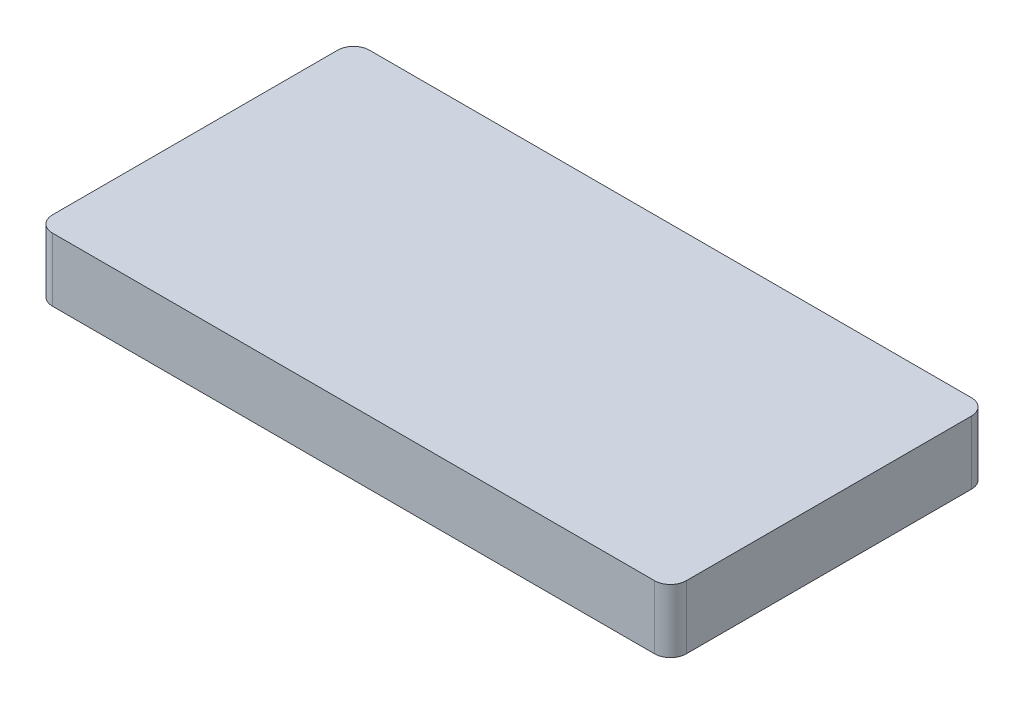
ISO-10303-21;
HEADER;
FILE_DESCRIPTION(('STEP AP214'),'2;1');
FILE_NAME('part.step','',(''),(''),'','','');
FILE_SCHEMA(('AUTOMOTIVE_DESIGN { 1 0 10303 214 1 1 1 1 }'));
ENDSEC;
DATA;
#1=APPLICATION_CONTEXT('core data for automotive mechanical design processes');
#2=APPLICATION_PROTOCOL_DEFINITION('international standard','automotive_design',2000,#1);
#3=PRODUCT_CONTEXT('',#1,'mechanical');
#4=PRODUCT('Part','Part','',(#3));
#5=PRODUCT_RELATED_PRODUCT_CATEGORY('part','',(#4));
#6=PRODUCT_DEFINITION_FORMATION('','',#4);
#7=PRODUCT_DEFINITION_CONTEXT('part definition',#1,'design');
#8=PRODUCT_DEFINITION('design','',#6,#7);
#9=PRODUCT_DEFINITION_SHAPE('','',#8);
#10=(LENGTH_UNIT() NAMED_UNIT(*) SI_UNIT(.MILLI.,.METRE.));
#11=(NAMED_UNIT(*) PLANE_ANGLE_UNIT() SI_UNIT($,.RADIAN.));
#12=(NAMED_UNIT(*) SI_UNIT($,.STERADIAN.) SOLID_ANGLE_UNIT());
#13=UNCERTAINTY_MEASURE_WITH_UNIT(LENGTH_MEASURE(1.E-05),#10,'distance_accuracy_value','');
#14=(GEOMETRIC_REPRESENTATION_CONTEXT(3) GLOBAL_UNCERTAINTY_ASSIGNED_CONTEXT((#13)) GLOBAL_UNIT_ASSIGNED_CONTEXT((#10,
#11,#12)) REPRESENTATION_CONTEXT('',''));
#15=CARTESIAN_POINT('',(0.,0.,0.));
#16=DIRECTION('',(0.,0.,1.));
#17=DIRECTION('',(1.,0.,0.));
#18=AXIS2_PLACEMENT_3D('',#15,#16,#17);
#19=CARTESIAN_POINT('',(0.,2.54,-12.7));
#20=DIRECTION('',(1.,0.,0.));
#21=DIRECTION('',(0.,0.,-1.));
#22=AXIS2_PLACEMENT_3D('',#19,#20,#21);
#23=PLANE('',#22);
#24=DIRECTION('',(0.,0.,1.));
#25=VECTOR('',#24,1.);
#26=CARTESIAN_POINT('',(0.,2.54,-12.7));
#27=LINE('',#26,#25);
#28=CARTESIAN_POINT('',(0.,2.54,-12.065));
#29=VERTEX_POINT('',#28);
#30=CARTESIAN_POINT('',(0.,2.54,-0.635));
#31=VERTEX_POINT('',#30);
#32=EDGE_CURVE('E161',#29,#31,#27,.T.);
#33=ORIENTED_EDGE('',*,*,#32,.F.);
#34=DIRECTION('',(0.,-1.,0.));
#35=VECTOR('',#34,1.);
#36=CARTESIAN_POINT('',(0.,2.54,-12.065));
#37=LINE('',#36,#35);
#38=CARTESIAN_POINT('',(0.,0.,-12.065));
#39=VERTEX_POINT('',#38);
#40=EDGE_CURVE('E186',#29,#39,#37,.T.);
#41=ORIENTED_EDGE('',*,*,#40,.T.);
#42=DIRECTION('',(0.,0.,1.));
#43=VECTOR('',#42,1.);
#44=CARTESIAN_POINT('',(0.,0.,-12.7));
#45=LINE('',#44,#43);
#46=CARTESIAN_POINT('',(0.,0.,-0.635));
#47=VERTEX_POINT('',#46);
#48=EDGE_CURVE('E174',#39,#47,#45,.T.);
#49=ORIENTED_EDGE('',*,*,#48,.T.);
#50=DIRECTION('',(0.,-1.,0.));
#51=VECTOR('',#50,1.);
#52=CARTESIAN_POINT('',(0.,2.54,-0.635));
#53=LINE('',#52,#51);
#54=EDGE_CURVE('E173',#47,#31,#53,.F.);
#55=ORIENTED_EDGE('',*,*,#54,.T.);
#56=EDGE_LOOP('',(#33,#41,#49,#55));
#57=FACE_BOUND('',#56,.T.);
#58=ADVANCED_FACE('F32',(#57),#23,.F.);
#59=CARTESIAN_POINT('',(0.,2.54,0.));
#60=DIRECTION('',(0.,0.,-1.));
#61=DIRECTION('',(-1.,0.,0.));
#62=AXIS2_PLACEMENT_3D('',#59,#60,#61);
#63=PLANE('',#62);
#64=DIRECTION('',(1.,0.,0.));
#65=VECTOR('',#64,1.);
#66=CARTESIAN_POINT('',(0.,0.,0.));
#67=LINE('',#66,#65);
#68=CARTESIAN_POINT('',(0.635,0.,0.));
#69=VERTEX_POINT('',#68);
#70=CARTESIAN_POINT('',(24.765,0.,0.));
#71=VERTEX_POINT('',#70);
#72=EDGE_CURVE('E177',#69,#71,#67,.T.);
#73=ORIENTED_EDGE('',*,*,#72,.T.);
#74=DIRECTION('',(0.,-1.,0.));
#75=VECTOR('',#74,1.);
#76=CARTESIAN_POINT('',(24.765,2.54,0.));
#77=LINE('',#76,#75);
#78=CARTESIAN_POINT('',(24.765,2.54,0.));
#79=VERTEX_POINT('',#78);
#80=EDGE_CURVE('E40',#71,#79,#77,.F.);
#81=ORIENTED_EDGE('',*,*,#80,.T.);
#82=DIRECTION('',(1.,0.,0.));
#83=VECTOR('',#82,1.);
#84=CARTESIAN_POINT('',(0.,2.54,0.));
#85=LINE('',#84,#83);
#86=CARTESIAN_POINT('',(0.635,2.54,0.));
#87=VERTEX_POINT('',#86);
#88=EDGE_CURVE('E164',#87,#79,#85,.T.);
#89=ORIENTED_EDGE('',*,*,#88,.F.);
#90=DIRECTION('',(0.,-1.,0.));
#91=VECTOR('',#90,1.);
#92=CARTESIAN_POINT('',(0.635,2.54,0.));
#93=LINE('',#92,#91);
#94=EDGE_CURVE('E214',#87,#69,#93,.T.);
#95=ORIENTED_EDGE('',*,*,#94,.T.);
#96=EDGE_LOOP('',(#73,#81,#89,#95));
#97=FACE_BOUND('',#96,.T.);
#98=ADVANCED_FACE('F219',(#97),#63,.F.);
#99=CARTESIAN_POINT('',(25.4,2.54,0.));
#100=DIRECTION('',(-1.,0.,0.));
#101=DIRECTION('',(0.,0.,1.));
#102=AXIS2_PLACEMENT_3D('',#99,#100,#101);
#103=PLANE('',#102);
#104=DIRECTION('',(0.,0.,-1.));
#105=VECTOR('',#104,1.);
#106=CARTESIAN_POINT('',(25.4,0.,0.));
#107=LINE('',#106,#105);
#108=CARTESIAN_POINT('',(25.4,0.,-0.635000000000001));
#109=VERTEX_POINT('',#108);
#110=CARTESIAN_POINT('',(25.4,0.,-12.065));
#111=VERTEX_POINT('',#110);
#112=EDGE_CURVE('E181',#109,#111,#107,.T.);
#113=ORIENTED_EDGE('',*,*,#112,.T.);
#114=DIRECTION('',(0.,-1.,0.));
#115=VECTOR('',#114,1.);
#116=CARTESIAN_POINT('',(25.4,2.54,-12.065));
#117=LINE('',#116,#115);
#118=CARTESIAN_POINT('',(25.4,2.54,-12.065));
#119=VERTEX_POINT('',#118);
#120=EDGE_CURVE('E55',#111,#119,#117,.F.);
#121=ORIENTED_EDGE('',*,*,#120,.T.);
#122=DIRECTION('',(0.,0.,-1.));
#123=VECTOR('',#122,1.);
#124=CARTESIAN_POINT('',(25.4,2.54,0.));
#125=LINE('',#124,#123);
#126=CARTESIAN_POINT('',(25.4,2.54,-0.635000000000001));
#127=VERTEX_POINT('',#126);
#128=EDGE_CURVE('E168',#127,#119,#125,.T.);
#129=ORIENTED_EDGE('',*,*,#128,.F.);
#130=DIRECTION('',(0.,-1.,0.));
#131=VECTOR('',#130,1.);
#132=CARTESIAN_POINT('',(25.4,2.54,-0.635000000000001));
#133=LINE('',#132,#131);
#134=EDGE_CURVE('E210',#127,#109,#133,.T.);
#135=ORIENTED_EDGE('',*,*,#134,.T.);
#136=EDGE_LOOP('',(#113,#121,#129,#135));
#137=FACE_BOUND('',#136,.T.);
#138=ADVANCED_FACE('F230',(#137),#103,.F.);
#139=CARTESIAN_POINT('',(25.4,2.54,-12.7));
#140=DIRECTION('',(0.,0.,1.));
#141=DIRECTION('',(1.,0.,0.));
#142=AXIS2_PLACEMENT_3D('',#139,#140,#141);
#143=PLANE('',#142);
#144=DIRECTION('',(-1.,0.,0.));
#145=VECTOR('',#144,1.);
#146=CARTESIAN_POINT('',(25.4,0.,-12.7));
#147=LINE('',#146,#145);
#148=CARTESIAN_POINT('',(24.765,0.,-12.7));
#149=VERTEX_POINT('',#148);
#150=CARTESIAN_POINT('',(0.634999999999997,0.,-12.7));
#151=VERTEX_POINT('',#150);
#152=EDGE_CURVE('E165',#149,#151,#147,.T.);
#153=ORIENTED_EDGE('',*,*,#152,.T.);
#154=DIRECTION('',(0.,-1.,0.));
#155=VECTOR('',#154,1.);
#156=CARTESIAN_POINT('',(0.634999999999997,2.54,-12.7));
#157=LINE('',#156,#155);
#158=CARTESIAN_POINT('',(0.634999999999997,2.54,-12.7));
#159=VERTEX_POINT('',#158);
#160=EDGE_CURVE('E200',#151,#159,#157,.F.);
#161=ORIENTED_EDGE('',*,*,#160,.T.);
#162=DIRECTION('',(-1.,0.,0.));
#163=VECTOR('',#162,1.);
#164=CARTESIAN_POINT('',(25.4,2.54,-12.7));
#165=LINE('',#164,#163);
#166=CARTESIAN_POINT('',(24.765,2.54,-12.7));
#167=VERTEX_POINT('',#166);
#168=EDGE_CURVE('E170',#167,#159,#165,.T.);
#169=ORIENTED_EDGE('',*,*,#168,.F.);
#170=DIRECTION('',(0.,-1.,0.));
#171=VECTOR('',#170,1.);
#172=CARTESIAN_POINT('',(24.765,2.54,-12.7));
#173=LINE('',#172,#171);
#174=EDGE_CURVE('E197',#167,#149,#173,.T.);
#175=ORIENTED_EDGE('',*,*,#174,.T.);
#176=EDGE_LOOP('',(#153,#161,#169,#175));
#177=FACE_BOUND('',#176,.T.);
#178=ADVANCED_FACE('F241',(#177),#143,.F.);
#179=CARTESIAN_POINT('',(0.,2.54,0.));
#180=DIRECTION('',(0.,1.,0.));
#181=DIRECTION('',(0.,0.,1.));
#182=AXIS2_PLACEMENT_3D('',#179,#180,#181);
#183=PLANE('',#182);
#184=ORIENTED_EDGE('',*,*,#168,.T.);
#185=CARTESIAN_POINT('',(0.634999999999995,2.54,-12.065));
#186=DIRECTION('',(0.,1.,0.));
#187=DIRECTION('',(0.,0.,1.));
#188=AXIS2_PLACEMENT_3D('',#185,#186,#187);
#189=CIRCLE('',#188,0.635);
#190=EDGE_CURVE('E208',#159,#29,#189,.T.);
#191=ORIENTED_EDGE('',*,*,#190,.T.);
#192=ORIENTED_EDGE('',*,*,#32,.T.);
#193=CARTESIAN_POINT('',(0.635,2.54,-0.635));
#194=DIRECTION('',(0.,1.,0.));
#195=DIRECTION('',(0.,0.,1.));
#196=AXIS2_PLACEMENT_3D('',#193,#194,#195);
#197=CIRCLE('',#196,0.635);
#198=EDGE_CURVE('E202',#31,#87,#197,.T.);
#199=ORIENTED_EDGE('',*,*,#198,.T.);
#200=ORIENTED_EDGE('',*,*,#88,.T.);
#201=CARTESIAN_POINT('',(24.765,2.54,-0.635));
#202=DIRECTION('',(0.,1.,0.));
#203=DIRECTION('',(0.,0.,1.));
#204=AXIS2_PLACEMENT_3D('',#201,#202,#203);
#205=CIRCLE('',#204,0.635);
#206=EDGE_CURVE('E204',#79,#127,#205,.T.);
#207=ORIENTED_EDGE('',*,*,#206,.T.);
#208=ORIENTED_EDGE('',*,*,#128,.T.);
#209=CARTESIAN_POINT('',(24.765,2.54,-12.065));
#210=DIRECTION('',(0.,1.,0.));
#211=DIRECTION('',(0.,0.,1.));
#212=AXIS2_PLACEMENT_3D('',#209,#210,#211);
#213=CIRCLE('',#212,0.635);
#214=EDGE_CURVE('E206',#119,#167,#213,.T.);
#215=ORIENTED_EDGE('',*,*,#214,.T.);
#216=EDGE_LOOP('',(#184,#191,#192,#199,#200,#207,#208,#215));
#217=FACE_BOUND('',#216,.T.);
#218=ADVANCED_FACE('F225',(#217),#183,.T.);
#219=CARTESIAN_POINT('',(0.,0.,0.));
#220=DIRECTION('',(0.,1.,0.));
#221=DIRECTION('',(0.,0.,1.));
#222=AXIS2_PLACEMENT_3D('',#219,#220,#221);
#223=PLANE('',#222);
#224=DIRECTION('',(-1.,0.,0.));
#225=VECTOR('',#224,1.);
#226=CARTESIAN_POINT('',(25.4,0.,-12.065));
#227=LINE('',#226,#225);
#228=CARTESIAN_POINT('',(24.765,0.,-12.065));
#229=VERTEX_POINT('',#228);
#230=CARTESIAN_POINT('',(0.634999999999995,0.,-12.065));
#231=VERTEX_POINT('',#230);
#232=EDGE_CURVE('E133',#229,#231,#227,.T.);
#233=ORIENTED_EDGE('',*,*,#232,.T.);
#234=DIRECTION('',(0.,0.,1.));
#235=VECTOR('',#234,1.);
#236=CARTESIAN_POINT('',(0.634999999999995,0.,-12.7));
#237=LINE('',#236,#235);
#238=CARTESIAN_POINT('',(0.635,0.,-0.635));
#239=VERTEX_POINT('',#238);
#240=EDGE_CURVE('E139',#231,#239,#237,.T.);
#241=ORIENTED_EDGE('',*,*,#240,.T.);
#242=DIRECTION('',(1.,0.,0.));
#243=VECTOR('',#242,1.);
#244=CARTESIAN_POINT('',(0.,0.,-0.635));
#245=LINE('',#244,#243);
#246=CARTESIAN_POINT('',(24.765,0.,-0.635));
#247=VERTEX_POINT('',#246);
#248=EDGE_CURVE('E155',#239,#247,#245,.T.);
#249=ORIENTED_EDGE('',*,*,#248,.T.);
#250=DIRECTION('',(0.,0.,-1.));
#251=VECTOR('',#250,1.);
#252=CARTESIAN_POINT('',(24.765,0.,0.));
#253=LINE('',#252,#251);
#254=EDGE_CURVE('E47',#247,#229,#253,.T.);
#255=ORIENTED_EDGE('',*,*,#254,.T.);
#256=EDGE_LOOP('',(#233,#241,#249,#255));
#257=FACE_BOUND('',#256,.T.);
#258=ORIENTED_EDGE('',*,*,#48,.F.);
#259=CARTESIAN_POINT('',(0.634999999999995,0.,-12.065));
#260=DIRECTION('',(0.,1.,0.));
#261=DIRECTION('',(0.,0.,1.));
#262=AXIS2_PLACEMENT_3D('',#259,#260,#261);
#263=CIRCLE('',#262,0.635);
#264=EDGE_CURVE('E195',#39,#151,#263,.F.);
#265=ORIENTED_EDGE('',*,*,#264,.T.);
#266=ORIENTED_EDGE('',*,*,#152,.F.);
#267=CARTESIAN_POINT('',(24.765,0.,-12.065));
#268=DIRECTION('',(0.,1.,0.));
#269=DIRECTION('',(0.,0.,1.));
#270=AXIS2_PLACEMENT_3D('',#267,#268,#269);
#271=CIRCLE('',#270,0.635);
#272=EDGE_CURVE('E193',#149,#111,#271,.F.);
#273=ORIENTED_EDGE('',*,*,#272,.T.);
#274=ORIENTED_EDGE('',*,*,#112,.F.);
#275=CARTESIAN_POINT('',(24.765,0.,-0.635));
#276=DIRECTION('',(0.,1.,0.));
#277=DIRECTION('',(0.,0.,1.));
#278=AXIS2_PLACEMENT_3D('',#275,#276,#277);
#279=CIRCLE('',#278,0.635);
#280=EDGE_CURVE('E191',#109,#71,#279,.F.);
#281=ORIENTED_EDGE('',*,*,#280,.T.);
#282=ORIENTED_EDGE('',*,*,#72,.F.);
#283=CARTESIAN_POINT('',(0.635,0.,-0.635));
#284=DIRECTION('',(0.,1.,0.));
#285=DIRECTION('',(0.,0.,1.));
#286=AXIS2_PLACEMENT_3D('',#283,#284,#285);
#287=CIRCLE('',#286,0.635);
#288=EDGE_CURVE('E189',#69,#47,#287,.F.);
#289=ORIENTED_EDGE('',*,*,#288,.T.);
#290=EDGE_LOOP('',(#258,#265,#266,#273,#274,#281,#282,#289));
#291=FACE_BOUND('',#290,.T.);
#292=ADVANCED_FACE('F233',(#257,#291),#223,.F.);
#293=CARTESIAN_POINT('',(0.634999999999995,2.54,-12.065));
#294=DIRECTION('',(0.,-1.,0.));
#295=DIRECTION('',(0.,0.,-1.));
#296=AXIS2_PLACEMENT_3D('',#293,#294,#295);
#297=CYLINDRICAL_SURFACE('',#296,0.635);
#298=ORIENTED_EDGE('',*,*,#190,.F.);
#299=ORIENTED_EDGE('',*,*,#160,.F.);
#300=ORIENTED_EDGE('',*,*,#264,.F.);
#301=ORIENTED_EDGE('',*,*,#40,.F.);
#302=EDGE_LOOP('',(#298,#299,#300,#301));
#303=FACE_BOUND('',#302,.T.);
#304=ADVANCED_FACE('F247',(#303),#297,.T.);
#305=CARTESIAN_POINT('',(24.765,2.54,-12.065));
#306=DIRECTION('',(0.,-1.,0.));
#307=DIRECTION('',(0.,0.,-1.));
#308=AXIS2_PLACEMENT_3D('',#305,#306,#307);
#309=CYLINDRICAL_SURFACE('',#308,0.635);
#310=ORIENTED_EDGE('',*,*,#214,.F.);
#311=ORIENTED_EDGE('',*,*,#120,.F.);
#312=ORIENTED_EDGE('',*,*,#272,.F.);
#313=ORIENTED_EDGE('',*,*,#174,.F.);
#314=EDGE_LOOP('',(#310,#311,#312,#313));
#315=FACE_BOUND('',#314,.T.);
#316=ADVANCED_FACE('F238',(#315),#309,.T.);
#317=CARTESIAN_POINT('',(24.765,2.54,-0.635));
#318=DIRECTION('',(0.,-1.,0.));
#319=DIRECTION('',(0.,0.,-1.));
#320=AXIS2_PLACEMENT_3D('',#317,#318,#319);
#321=CYLINDRICAL_SURFACE('',#320,0.635);
#322=ORIENTED_EDGE('',*,*,#206,.F.);
#323=ORIENTED_EDGE('',*,*,#80,.F.);
#324=ORIENTED_EDGE('',*,*,#280,.F.);
#325=ORIENTED_EDGE('',*,*,#134,.F.);
#326=EDGE_LOOP('',(#322,#323,#324,#325));
#327=FACE_BOUND('',#326,.T.);
#328=ADVANCED_FACE('F228',(#327),#321,.T.);
#329=CARTESIAN_POINT('',(0.635,2.54,-0.635));
#330=DIRECTION('',(0.,-1.,0.));
#331=DIRECTION('',(0.,0.,-1.));
#332=AXIS2_PLACEMENT_3D('',#329,#330,#331);
#333=CYLINDRICAL_SURFACE('',#332,0.635);
#334=ORIENTED_EDGE('',*,*,#198,.F.);
#335=ORIENTED_EDGE('',*,*,#54,.F.);
#336=ORIENTED_EDGE('',*,*,#288,.F.);
#337=ORIENTED_EDGE('',*,*,#94,.F.);
#338=EDGE_LOOP('',(#334,#335,#336,#337));
#339=FACE_BOUND('',#338,.T.);
#340=ADVANCED_FACE('F34',(#339),#333,.T.);
#341=CARTESIAN_POINT('',(0.634999999999995,2.54,-12.7));
#342=DIRECTION('',(1.,0.,0.));
#343=DIRECTION('',(0.,0.,-1.));
#344=AXIS2_PLACEMENT_3D('',#341,#342,#343);
#345=PLANE('',#344);
#346=DIRECTION('',(0.,0.,1.));
#347=VECTOR('',#346,1.);
#348=CARTESIAN_POINT('',(0.634999999999995,1.905,-12.7));
#349=LINE('',#348,#347);
#350=CARTESIAN_POINT('',(0.634999999999995,1.905,-12.065));
#351=VERTEX_POINT('',#350);
#352=CARTESIAN_POINT('',(0.635,1.905,-0.635));
#353=VERTEX_POINT('',#352);
#354=EDGE_CURVE('E123',#351,#353,#349,.T.);
#355=ORIENTED_EDGE('',*,*,#354,.T.);
#356=DIRECTION('',(0.,1.,0.));
#357=VECTOR('',#356,1.);
#358=CARTESIAN_POINT('',(0.635,2.54,-0.635));
#359=LINE('',#358,#357);
#360=EDGE_CURVE('E144',#239,#353,#359,.T.);
#361=ORIENTED_EDGE('',*,*,#360,.F.);
#362=ORIENTED_EDGE('',*,*,#240,.F.);
#363=DIRECTION('',(0.,1.,0.));
#364=VECTOR('',#363,1.);
#365=CARTESIAN_POINT('',(0.634999999999993,2.54,-12.065));
#366=LINE('',#365,#364);
#367=EDGE_CURVE('E136',#231,#351,#366,.T.);
#368=ORIENTED_EDGE('',*,*,#367,.T.);
#369=EDGE_LOOP('',(#355,#361,#362,#368));
#370=FACE_BOUND('',#369,.T.);
#371=ADVANCED_FACE('F137',(#370),#345,.T.);
#372=CARTESIAN_POINT('',(0.,2.54,-0.635));
#373=DIRECTION('',(0.,0.,-1.));
#374=DIRECTION('',(-1.,0.,0.));
#375=AXIS2_PLACEMENT_3D('',#372,#373,#374);
#376=PLANE('',#375);
#377=ORIENTED_EDGE('',*,*,#248,.F.);
#378=ORIENTED_EDGE('',*,*,#360,.T.);
#379=DIRECTION('',(1.,0.,0.));
#380=VECTOR('',#379,1.);
#381=CARTESIAN_POINT('',(0.,1.905,-0.635));
#382=LINE('',#381,#380);
#383=CARTESIAN_POINT('',(24.765,1.905,-0.635));
#384=VERTEX_POINT('',#383);
#385=EDGE_CURVE('E130',#353,#384,#382,.T.);
#386=ORIENTED_EDGE('',*,*,#385,.T.);
#387=DIRECTION('',(0.,1.,0.));
#388=VECTOR('',#387,1.);
#389=CARTESIAN_POINT('',(24.765,2.54,-0.635));
#390=LINE('',#389,#388);
#391=EDGE_CURVE('E178',#247,#384,#390,.T.);
#392=ORIENTED_EDGE('',*,*,#391,.F.);
#393=EDGE_LOOP('',(#377,#378,#386,#392));
#394=FACE_BOUND('',#393,.T.);
#395=ADVANCED_FACE('F256',(#394),#376,.T.);
#396=CARTESIAN_POINT('',(24.765,2.54,0.));
#397=DIRECTION('',(-1.,0.,0.));
#398=DIRECTION('',(0.,0.,1.));
#399=AXIS2_PLACEMENT_3D('',#396,#397,#398);
#400=PLANE('',#399);
#401=ORIENTED_EDGE('',*,*,#254,.F.);
#402=ORIENTED_EDGE('',*,*,#391,.T.);
#403=DIRECTION('',(0.,0.,-1.));
#404=VECTOR('',#403,1.);
#405=CARTESIAN_POINT('',(24.765,1.905,0.));
#406=LINE('',#405,#404);
#407=CARTESIAN_POINT('',(24.765,1.905,-12.065));
#408=VERTEX_POINT('',#407);
#409=EDGE_CURVE('E148',#384,#408,#406,.T.);
#410=ORIENTED_EDGE('',*,*,#409,.T.);
#411=DIRECTION('',(0.,1.,0.));
#412=VECTOR('',#411,1.);
#413=CARTESIAN_POINT('',(24.765,2.54,-12.065));
#414=LINE('',#413,#412);
#415=EDGE_CURVE('E143',#229,#408,#414,.T.);
#416=ORIENTED_EDGE('',*,*,#415,.F.);
#417=EDGE_LOOP('',(#401,#402,#410,#416));
#418=FACE_BOUND('',#417,.T.);
#419=ADVANCED_FACE('F308',(#418),#400,.T.);
#420=CARTESIAN_POINT('',(25.4,2.54,-12.065));
#421=DIRECTION('',(0.,0.,1.));
#422=DIRECTION('',(1.,0.,0.));
#423=AXIS2_PLACEMENT_3D('',#420,#421,#422);
#424=PLANE('',#423);
#425=ORIENTED_EDGE('',*,*,#232,.F.);
#426=ORIENTED_EDGE('',*,*,#415,.T.);
#427=DIRECTION('',(-1.,0.,0.));
#428=VECTOR('',#427,1.);
#429=CARTESIAN_POINT('',(25.4,1.905,-12.065));
#430=LINE('',#429,#428);
#431=EDGE_CURVE('E127',#408,#351,#430,.T.);
#432=ORIENTED_EDGE('',*,*,#431,.T.);
#433=ORIENTED_EDGE('',*,*,#367,.F.);
#434=EDGE_LOOP('',(#425,#426,#432,#433));
#435=FACE_BOUND('',#434,.T.);
#436=ADVANCED_FACE('F146',(#435),#424,.T.);
#437=CARTESIAN_POINT('',(0.,1.905,0.));
#438=DIRECTION('',(0.,1.,0.));
#439=DIRECTION('',(0.,0.,1.));
#440=AXIS2_PLACEMENT_3D('',#437,#438,#439);
#441=PLANE('',#440);
#442=CARTESIAN_POINT('',(12.7,1.905,-6.35));
#443=DIRECTION('',(0.,1.,0.));
#444=DIRECTION('',(0.,0.,1.));
#445=AXIS2_PLACEMENT_3D('',#442,#443,#444);
#446=CIRCLE('',#445,2.54);
#447=CARTESIAN_POINT('',(12.7,1.905,-3.81));
#448=VERTEX_POINT('',#447);
#449=EDGE_CURVE('E11',#448,#448,#446,.F.);
#450=ORIENTED_EDGE('',*,*,#449,.F.);
#451=EDGE_LOOP('',(#450));
#452=FACE_BOUND('',#451,.T.);
#453=ORIENTED_EDGE('',*,*,#431,.F.);
#454=ORIENTED_EDGE('',*,*,#409,.F.);
#455=ORIENTED_EDGE('',*,*,#385,.F.);
#456=ORIENTED_EDGE('',*,*,#354,.F.);
#457=EDGE_LOOP('',(#453,#454,#455,#456));
#458=FACE_BOUND('',#457,.T.);
#459=ADVANCED_FACE('F125',(#452,#458),#441,.F.);
#460=CARTESIAN_POINT('',(12.7,-7.18420489685532,-6.35));
#461=DIRECTION('',(0.,1.,0.));
#462=DIRECTION('',(0.,0.,1.));
#463=AXIS2_PLACEMENT_3D('',#460,#461,#462);
#464=CYLINDRICAL_SURFACE('',#463,2.54);
#465=CARTESIAN_POINT('',(12.7,0.,-6.35));
#466=DIRECTION('',(0.,1.,0.));
#467=DIRECTION('',(0.,0.,1.));
#468=AXIS2_PLACEMENT_3D('',#465,#466,#467);
#469=CIRCLE('',#468,2.54);
#470=CARTESIAN_POINT('',(12.7,0.,-3.81));
#471=VERTEX_POINT('',#470);
#472=EDGE_CURVE('E156',#471,#471,#469,.T.);
#473=CARTESIAN_POINT('',(12.7,0.,-3.81));
#474=CARTESIAN_POINT('',(12.7,0.0198437499999991,-3.81));
#475=CARTESIAN_POINT('',(12.7,0.0396874999999989,-3.81));
#476=CARTESIAN_POINT('',(12.7,0.079374999999999,-3.81));
#477=CARTESIAN_POINT('',(12.7,0.0992187499999992,-3.81));
#478=CARTESIAN_POINT('',(12.7,0.138906249999999,-3.81));
#479=CARTESIAN_POINT('',(12.7,0.158749999999999,-3.81));
#480=CARTESIAN_POINT('',(12.7,0.198437499999999,-3.81));
#481=CARTESIAN_POINT('',(12.7,0.218281249999999,-3.81));
#482=CARTESIAN_POINT('',(12.7,0.25796875,-3.81));
#483=CARTESIAN_POINT('',(12.7,0.277812499999999,-3.81));
#484=CARTESIAN_POINT('',(12.7,0.317499999999999,-3.81));
#485=CARTESIAN_POINT('',(12.7,0.337343749999999,-3.81));
#486=CARTESIAN_POINT('',(12.7,0.377031249999999,-3.81));
#487=CARTESIAN_POINT('',(12.7,0.396874999999999,-3.81));
#488=CARTESIAN_POINT('',(12.7,0.436562499999999,-3.81));
#489=CARTESIAN_POINT('',(12.7,0.456406249999999,-3.81));
#490=CARTESIAN_POINT('',(12.7,0.496093749999999,-3.81));
#491=CARTESIAN_POINT('',(12.7,0.515937499999999,-3.81));
#492=CARTESIAN_POINT('',(12.7,0.555624999999999,-3.81));
#493=CARTESIAN_POINT('',(12.7,0.575468749999999,-3.81));
#494=CARTESIAN_POINT('',(12.7,0.615156249999999,-3.81));
#495=CARTESIAN_POINT('',(12.7,0.634999999999999,-3.81));
#496=CARTESIAN_POINT('',(12.7,0.674687499999998,-3.81));
#497=CARTESIAN_POINT('',(12.7,0.694531249999998,-3.81));
#498=CARTESIAN_POINT('',(12.7,0.734218749999998,-3.81));
#499=CARTESIAN_POINT('',(12.7,0.754062499999998,-3.81));
#500=CARTESIAN_POINT('',(12.7,0.793749999999998,-3.81));
#501=CARTESIAN_POINT('',(12.7,0.813593749999999,-3.81));
#502=CARTESIAN_POINT('',(12.7,0.853281249999999,-3.81));
#503=CARTESIAN_POINT('',(12.7,0.873124999999999,-3.81));
#504=CARTESIAN_POINT('',(12.7,0.912812499999999,-3.81));
#505=CARTESIAN_POINT('',(12.7,0.932656249999999,-3.81));
#506=CARTESIAN_POINT('',(12.7,0.972343749999998,-3.81));
#507=CARTESIAN_POINT('',(12.7,0.992187499999998,-3.81));
#508=CARTESIAN_POINT('',(12.7,1.031875,-3.81));
#509=CARTESIAN_POINT('',(12.7,1.05171875,-3.81));
#510=CARTESIAN_POINT('',(12.7,1.09140625,-3.81));
#511=CARTESIAN_POINT('',(12.7,1.11125,-3.81));
#512=CARTESIAN_POINT('',(12.7,1.1509375,-3.81));
#513=CARTESIAN_POINT('',(12.7,1.17078125,-3.81));
#514=CARTESIAN_POINT('',(12.7,1.21046875,-3.81));
#515=CARTESIAN_POINT('',(12.7,1.2303125,-3.81));
#516=CARTESIAN_POINT('',(12.7,1.27,-3.81));
#517=CARTESIAN_POINT('',(12.7,1.28984375,-3.81));
#518=CARTESIAN_POINT('',(12.7,1.32953125,-3.81));
#519=CARTESIAN_POINT('',(12.7,1.349375,-3.81));
#520=CARTESIAN_POINT('',(12.7,1.3890625,-3.81));
#521=CARTESIAN_POINT('',(12.7,1.40890625,-3.81));
#522=CARTESIAN_POINT('',(12.7,1.44859375,-3.81));
#523=CARTESIAN_POINT('',(12.7,1.4684375,-3.81));
#524=CARTESIAN_POINT('',(12.7,1.508125,-3.81));
#525=CARTESIAN_POINT('',(12.7,1.52796875,-3.81));
#526=CARTESIAN_POINT('',(12.7,1.56765625,-3.81));
#527=CARTESIAN_POINT('',(12.7,1.5875,-3.81));
#528=CARTESIAN_POINT('',(12.7,1.6271875,-3.81));
#529=CARTESIAN_POINT('',(12.7,1.64703125,-3.81));
#530=CARTESIAN_POINT('',(12.7,1.68671875,-3.81));
#531=CARTESIAN_POINT('',(12.7,1.7065625,-3.81));
#532=CARTESIAN_POINT('',(12.7,1.74625,-3.81));
#533=CARTESIAN_POINT('',(12.7,1.76609375,-3.81));
#534=CARTESIAN_POINT('',(12.7,1.80578125,-3.81));
#535=CARTESIAN_POINT('',(12.7,1.825625,-3.81));
#536=CARTESIAN_POINT('',(12.7,1.8653125,-3.81));
#537=CARTESIAN_POINT('',(12.7,1.88515625,-3.81));
#538=CARTESIAN_POINT('',(12.7,1.905,-3.81));
#539=B_SPLINE_CURVE_WITH_KNOTS('',3,(#473,#474,#475,#476,#477,#478,#479,#480,#481,#482,#483,
#484,#485,#486,#487,#488,#489,#490,#491,#492,#493,#494,#495,#496,#497,#498,#499,#500,#501,#502,
#503,#504,#505,#506,#507,#508,#509,#510,#511,#512,#513,#514,#515,#516,#517,#518,#519,#520,#521,
#522,#523,#524,#525,#526,#527,#528,#529,#530,#531,#532,#533,#534,#535,#536,#537,#538),
.UNSPECIFIED.,.F.,.F.,(4,2,2,2,2,2,2,2,2,2,2,2,2,2,2,2,2,2,2,2,2,2,2,2,2,2,2,2,2,2,2,2,4),(0.,
0.0595312499999997,0.1190625,0.17859375,0.238125,0.29765625,0.3571875,0.41671875,0.47625,
0.53578125,0.5953125,0.654843749999999,0.714374999999999,0.773906249999999,0.8334375,0.89296875,
0.952499999999999,1.01203125,1.0715625,1.13109375,1.190625,1.25015625,1.3096875,1.36921875,
1.42875,1.48828125,1.5478125,1.60734375,1.666875,1.72640625,1.7859375,1.84546875,1.905),.UNSPECIFIED.);
#540=EDGE_CURVE('BSEAM334',#471,#448,#539,.T.);
#541=ORIENTED_EDGE('',*,*,#472,.T.);
#542=ORIENTED_EDGE('',*,*,#449,.T.);
#543=ORIENTED_EDGE('',*,*,#540,.T.);
#544=ORIENTED_EDGE('',*,*,#540,.F.);
#545=EDGE_LOOP('',(#541,#543,#542,#544));
#546=FACE_BOUND('',#545,.T.);
#547=ADVANCED_FACE('F334',(#546),#464,.T.);
#548=CARTESIAN_POINT('',(0.,0.,0.));
#549=DIRECTION('',(0.,1.,0.));
#550=DIRECTION('',(0.,0.,1.));
#551=AXIS2_PLACEMENT_3D('',#548,#549,#550);
#552=PLANE('',#551);
#553=ORIENTED_EDGE('',*,*,#472,.F.);
#554=EDGE_LOOP('',(#553));
#555=FACE_BOUND('',#554,.T.);
#556=ADVANCED_FACE('F344',(#555),#552,.F.);
#557=CLOSED_SHELL('',(#58,#98,#138,#178,#218,#292,#304,#316,#328,#340,#371,#395,#419,#436,#459,
#547,#556));
#558=MANIFOLD_SOLID_BREP('B2',#557);
#559=ADVANCED_BREP_SHAPE_REPRESENTATION('',(#18,#558),#14);
#560=SHAPE_DEFINITION_REPRESENTATION(#9,#559);
ENDSEC;
END-ISO-10303-21;
